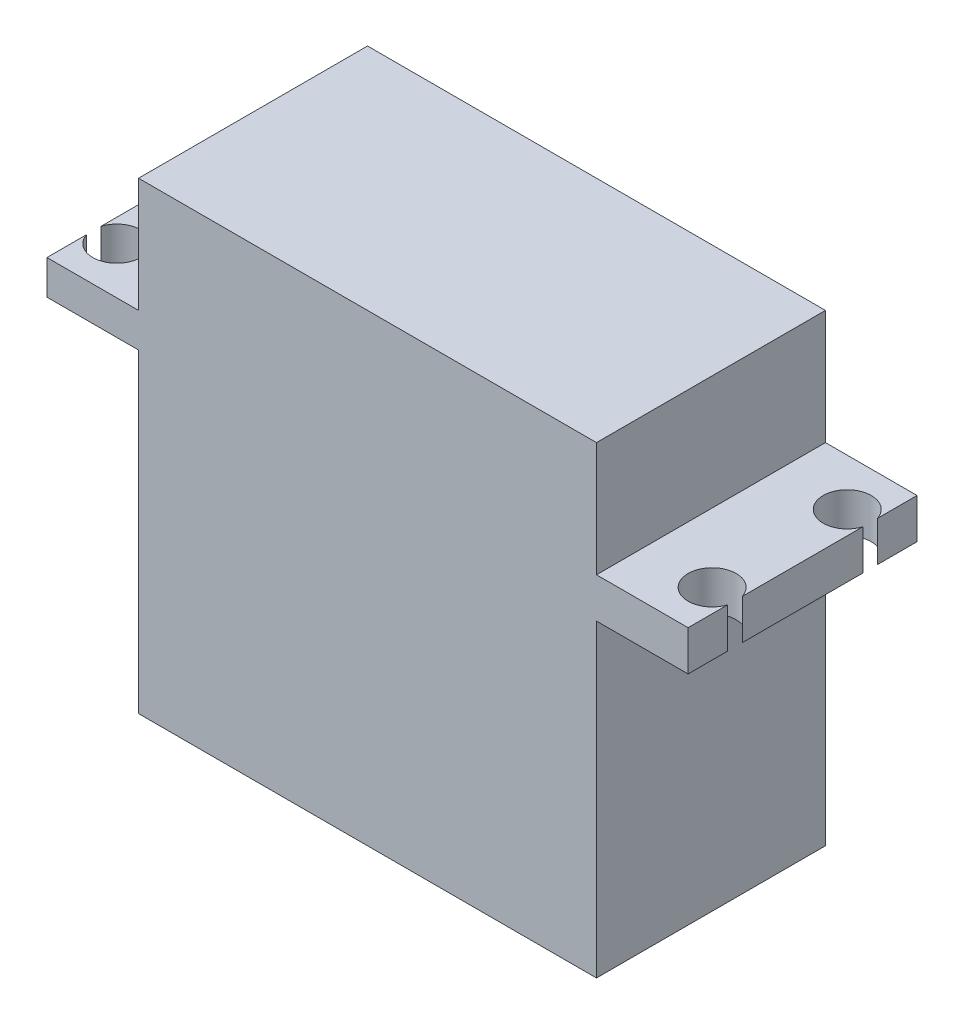
ISO-10303-21;
HEADER;
FILE_DESCRIPTION(('STEP AP214'),'2;1');
FILE_NAME('part.step','',(''),(''),'','','');
FILE_SCHEMA(('AUTOMOTIVE_DESIGN { 1 0 10303 214 1 1 1 1 }'));
ENDSEC;
DATA;
#1=APPLICATION_CONTEXT('core data for automotive mechanical design processes');
#2=APPLICATION_PROTOCOL_DEFINITION('international standard','automotive_design',2000,#1);
#3=PRODUCT_CONTEXT('',#1,'mechanical');
#4=PRODUCT('Part','Part','',(#3));
#5=PRODUCT_RELATED_PRODUCT_CATEGORY('part','',(#4));
#6=PRODUCT_DEFINITION_FORMATION('','',#4);
#7=PRODUCT_DEFINITION_CONTEXT('part definition',#1,'design');
#8=PRODUCT_DEFINITION('design','',#6,#7);
#9=PRODUCT_DEFINITION_SHAPE('','',#8);
#10=(LENGTH_UNIT() NAMED_UNIT(*) SI_UNIT(.MILLI.,.METRE.));
#11=(NAMED_UNIT(*) PLANE_ANGLE_UNIT() SI_UNIT($,.RADIAN.));
#12=(NAMED_UNIT(*) SI_UNIT($,.STERADIAN.) SOLID_ANGLE_UNIT());
#13=UNCERTAINTY_MEASURE_WITH_UNIT(LENGTH_MEASURE(1.E-05),#10,'distance_accuracy_value','');
#14=(GEOMETRIC_REPRESENTATION_CONTEXT(3) GLOBAL_UNCERTAINTY_ASSIGNED_CONTEXT((#13)) GLOBAL_UNIT_ASSIGNED_CONTEXT((#10,
#11,#12)) REPRESENTATION_CONTEXT('',''));
#15=CARTESIAN_POINT('',(0.,0.,0.));
#16=DIRECTION('',(0.,0.,1.));
#17=DIRECTION('',(1.,0.,0.));
#18=AXIS2_PLACEMENT_3D('',#15,#16,#17);
#19=CARTESIAN_POINT('',(-8.,0.,0.));
#20=DIRECTION('',(1.,0.,0.));
#21=DIRECTION('',(0.,0.,-1.));
#22=AXIS2_PLACEMENT_3D('',#19,#20,#21);
#23=PLANE('',#22);
#24=DIRECTION('',(0.,0.,1.));
#25=VECTOR('',#24,1.);
#26=CARTESIAN_POINT('',(-8.,27.5,0.));
#27=LINE('',#26,#25);
#28=CARTESIAN_POINT('',(-8.,27.5,-15.2596875762567));
#29=VERTEX_POINT('',#28);
#30=CARTESIAN_POINT('',(-8.,27.5,-4.74031242374329));
#31=VERTEX_POINT('',#30);
#32=EDGE_CURVE('E180',#29,#31,#27,.T.);
#33=ORIENTED_EDGE('',*,*,#32,.T.);
#34=DIRECTION('',(0.,1.,0.));
#35=VECTOR('',#34,1.);
#36=CARTESIAN_POINT('',(-8.,22.5,-4.74031242374329));
#37=LINE('',#36,#35);
#38=CARTESIAN_POINT('',(-8.,30.5,-4.74031242374329));
#39=VERTEX_POINT('',#38);
#40=EDGE_CURVE('E11',#31,#39,#37,.T.);
#41=ORIENTED_EDGE('',*,*,#40,.T.);
#42=DIRECTION('',(0.,0.,-1.));
#43=VECTOR('',#42,1.);
#44=CARTESIAN_POINT('',(-8.,30.5,-20.));
#45=LINE('',#44,#43);
#46=CARTESIAN_POINT('',(-8.,30.5,-15.2596875762567));
#47=VERTEX_POINT('',#46);
#48=EDGE_CURVE('E178',#39,#47,#45,.T.);
#49=ORIENTED_EDGE('',*,*,#48,.T.);
#50=DIRECTION('',(0.,1.,0.));
#51=VECTOR('',#50,1.);
#52=CARTESIAN_POINT('',(-8.,22.5,-15.2596875762567));
#53=LINE('',#52,#51);
#54=EDGE_CURVE('E304',#47,#29,#53,.F.);
#55=ORIENTED_EDGE('',*,*,#54,.T.);
#56=EDGE_LOOP('',(#33,#41,#49,#55));
#57=FACE_BOUND('',#56,.T.);
#58=ADVANCED_FACE('F33',(#57),#23,.F.);
#59=CARTESIAN_POINT('',(-8.,27.5,-20.));
#60=VERTEX_POINT('',#59);
#61=CARTESIAN_POINT('',(-8.,27.5,-16.5403124237433));
#62=VERTEX_POINT('',#61);
#63=EDGE_CURVE('E315',#60,#62,#27,.T.);
#64=ORIENTED_EDGE('',*,*,#63,.T.);
#65=DIRECTION('',(0.,1.,0.));
#66=VECTOR('',#65,1.);
#67=CARTESIAN_POINT('',(-8.,22.5,-16.5403124237433));
#68=LINE('',#67,#66);
#69=CARTESIAN_POINT('',(-8.,30.5,-16.5403124237433));
#70=VERTEX_POINT('',#69);
#71=EDGE_CURVE('E306',#62,#70,#68,.T.);
#72=ORIENTED_EDGE('',*,*,#71,.T.);
#73=CARTESIAN_POINT('',(-8.,30.5,-20.));
#74=VERTEX_POINT('',#73);
#75=EDGE_CURVE('E186',#70,#74,#45,.T.);
#76=ORIENTED_EDGE('',*,*,#75,.T.);
#77=DIRECTION('',(0.,-1.,0.));
#78=VECTOR('',#77,1.);
#79=CARTESIAN_POINT('',(-8.,27.5,-20.));
#80=LINE('',#79,#78);
#81=EDGE_CURVE('E188',#74,#60,#80,.T.);
#82=ORIENTED_EDGE('',*,*,#81,.T.);
#83=EDGE_LOOP('',(#64,#72,#76,#82));
#84=FACE_BOUND('',#83,.T.);
#85=ADVANCED_FACE('F334',(#84),#23,.F.);
#86=CARTESIAN_POINT('',(0.,0.,-20.));
#87=DIRECTION('',(-1.,0.,0.));
#88=DIRECTION('',(0.,0.,1.));
#89=AXIS2_PLACEMENT_3D('',#86,#87,#88);
#90=PLANE('',#89);
#91=DIRECTION('',(0.,0.,1.));
#92=VECTOR('',#91,1.);
#93=CARTESIAN_POINT('',(0.,27.5,0.));
#94=LINE('',#93,#92);
#95=CARTESIAN_POINT('',(0.,27.5,-20.));
#96=VERTEX_POINT('',#95);
#97=CARTESIAN_POINT('',(0.,27.5,0.));
#98=VERTEX_POINT('',#97);
#99=EDGE_CURVE('E195',#96,#98,#94,.T.);
#100=ORIENTED_EDGE('',*,*,#99,.F.);
#101=DIRECTION('',(0.,-1.,0.));
#102=VECTOR('',#101,1.);
#103=CARTESIAN_POINT('',(0.,0.,-20.));
#104=LINE('',#103,#102);
#105=CARTESIAN_POINT('',(0.,0.,-20.));
#106=VERTEX_POINT('',#105);
#107=EDGE_CURVE('E273',#96,#106,#104,.T.);
#108=ORIENTED_EDGE('',*,*,#107,.T.);
#109=DIRECTION('',(0.,0.,1.));
#110=VECTOR('',#109,1.);
#111=CARTESIAN_POINT('',(0.,0.,-20.));
#112=LINE('',#111,#110);
#113=CARTESIAN_POINT('',(0.,0.,0.));
#114=VERTEX_POINT('',#113);
#115=EDGE_CURVE('E289',#106,#114,#112,.T.);
#116=ORIENTED_EDGE('',*,*,#115,.T.);
#117=DIRECTION('',(0.,-1.,0.));
#118=VECTOR('',#117,1.);
#119=CARTESIAN_POINT('',(0.,0.,0.));
#120=LINE('',#119,#118);
#121=EDGE_CURVE('E286',#98,#114,#120,.T.);
#122=ORIENTED_EDGE('',*,*,#121,.F.);
#123=EDGE_LOOP('',(#100,#108,#116,#122));
#124=FACE_BOUND('',#123,.T.);
#125=ADVANCED_FACE('F339',(#124),#90,.T.);
#126=CARTESIAN_POINT('',(48.,0.,0.));
#127=DIRECTION('',(-1.,0.,0.));
#128=DIRECTION('',(0.,0.,1.));
#129=AXIS2_PLACEMENT_3D('',#126,#127,#128);
#130=PLANE('',#129);
#131=DIRECTION('',(0.,0.,-1.));
#132=VECTOR('',#131,1.);
#133=CARTESIAN_POINT('',(48.,27.,0.));
#134=LINE('',#133,#132);
#135=CARTESIAN_POINT('',(48.,27.,0.));
#136=VERTEX_POINT('',#135);
#137=CARTESIAN_POINT('',(48.,27.,-3.45968757625673));
#138=VERTEX_POINT('',#137);
#139=EDGE_CURVE('E235',#136,#138,#134,.T.);
#140=ORIENTED_EDGE('',*,*,#139,.T.);
#141=DIRECTION('',(0.,1.,0.));
#142=VECTOR('',#141,1.);
#143=CARTESIAN_POINT('',(48.,22.5000000000004,-3.45968757625673));
#144=LINE('',#143,#142);
#145=CARTESIAN_POINT('',(48.,30.5000000000004,-3.45968757625673));
#146=VERTEX_POINT('',#145);
#147=EDGE_CURVE('E221',#138,#146,#144,.T.);
#148=ORIENTED_EDGE('',*,*,#147,.T.);
#149=DIRECTION('',(0.,0.,1.));
#150=VECTOR('',#149,1.);
#151=CARTESIAN_POINT('',(48.,30.5000000000004,0.));
#152=LINE('',#151,#150);
#153=CARTESIAN_POINT('',(48.,30.5000000000004,0.));
#154=VERTEX_POINT('',#153);
#155=EDGE_CURVE('E241',#146,#154,#152,.T.);
#156=ORIENTED_EDGE('',*,*,#155,.T.);
#157=DIRECTION('',(0.,-1.,0.));
#158=VECTOR('',#157,1.);
#159=CARTESIAN_POINT('',(48.,27.,0.));
#160=LINE('',#159,#158);
#161=EDGE_CURVE('E230',#154,#136,#160,.T.);
#162=ORIENTED_EDGE('',*,*,#161,.T.);
#163=EDGE_LOOP('',(#140,#148,#156,#162));
#164=FACE_BOUND('',#163,.T.);
#165=ADVANCED_FACE('F353',(#164),#130,.F.);
#166=CARTESIAN_POINT('',(48.,30.5000000000004,-15.2596875762567));
#167=VERTEX_POINT('',#166);
#168=CARTESIAN_POINT('',(48.,30.5000000000004,-4.74031242374327));
#169=VERTEX_POINT('',#168);
#170=EDGE_CURVE('E246',#167,#169,#152,.T.);
#171=ORIENTED_EDGE('',*,*,#170,.T.);
#172=DIRECTION('',(0.,1.,0.));
#173=VECTOR('',#172,1.);
#174=CARTESIAN_POINT('',(48.,22.5000000000004,-4.74031242374327));
#175=LINE('',#174,#173);
#176=CARTESIAN_POINT('',(48.,27.,-4.74031242374327));
#177=VERTEX_POINT('',#176);
#178=EDGE_CURVE('E218',#169,#177,#175,.F.);
#179=ORIENTED_EDGE('',*,*,#178,.T.);
#180=CARTESIAN_POINT('',(48.,27.,-15.2596875762567));
#181=VERTEX_POINT('',#180);
#182=EDGE_CURVE('E239',#177,#181,#134,.T.);
#183=ORIENTED_EDGE('',*,*,#182,.T.);
#184=DIRECTION('',(0.,1.,0.));
#185=VECTOR('',#184,1.);
#186=CARTESIAN_POINT('',(48.,22.5000000000004,-15.2596875762567));
#187=LINE('',#186,#185);
#188=EDGE_CURVE('E301',#181,#167,#187,.T.);
#189=ORIENTED_EDGE('',*,*,#188,.T.);
#190=EDGE_LOOP('',(#171,#179,#183,#189));
#191=FACE_BOUND('',#190,.T.);
#192=ADVANCED_FACE('F409',(#191),#130,.F.);
#193=CARTESIAN_POINT('',(40.,40.5000000000004,-20.));
#194=DIRECTION('',(1.,0.,0.));
#195=DIRECTION('',(0.,1.,0.));
#196=AXIS2_PLACEMENT_3D('',#193,#194,#195);
#197=PLANE('',#196);
#198=DIRECTION('',(0.,0.,1.));
#199=VECTOR('',#198,1.);
#200=CARTESIAN_POINT('',(40.,30.5000000000004,0.));
#201=LINE('',#200,#199);
#202=CARTESIAN_POINT('',(40.,30.5000000000004,-20.));
#203=VERTEX_POINT('',#202);
#204=CARTESIAN_POINT('',(40.,30.5000000000004,0.));
#205=VERTEX_POINT('',#204);
#206=EDGE_CURVE('E234',#203,#205,#201,.T.);
#207=ORIENTED_EDGE('',*,*,#206,.F.);
#208=DIRECTION('',(0.,1.,0.));
#209=VECTOR('',#208,1.);
#210=CARTESIAN_POINT('',(40.,40.5000000000004,-20.));
#211=LINE('',#210,#209);
#212=CARTESIAN_POINT('',(40.,40.5000000000004,-20.));
#213=VERTEX_POINT('',#212);
#214=EDGE_CURVE('E266',#203,#213,#211,.T.);
#215=ORIENTED_EDGE('',*,*,#214,.T.);
#216=DIRECTION('',(0.,0.,1.));
#217=VECTOR('',#216,1.);
#218=CARTESIAN_POINT('',(40.,40.5000000000004,-20.));
#219=LINE('',#218,#217);
#220=CARTESIAN_POINT('',(40.,40.5000000000004,0.));
#221=VERTEX_POINT('',#220);
#222=EDGE_CURVE('E295',#213,#221,#219,.T.);
#223=ORIENTED_EDGE('',*,*,#222,.T.);
#224=DIRECTION('',(0.,1.,0.));
#225=VECTOR('',#224,1.);
#226=CARTESIAN_POINT('',(40.,40.5000000000004,0.));
#227=LINE('',#226,#225);
#228=EDGE_CURVE('E279',#205,#221,#227,.T.);
#229=ORIENTED_EDGE('',*,*,#228,.F.);
#230=EDGE_LOOP('',(#207,#215,#223,#229));
#231=FACE_BOUND('',#230,.T.);
#232=ADVANCED_FACE('F363',(#231),#197,.T.);
#233=CARTESIAN_POINT('',(40.,0.,-20.));
#234=DIRECTION('',(0.,-1.,0.));
#235=DIRECTION('',(1.,0.,0.));
#236=AXIS2_PLACEMENT_3D('',#233,#234,#235);
#237=PLANE('',#236);
#238=DIRECTION('',(1.,0.,0.));
#239=VECTOR('',#238,1.);
#240=CARTESIAN_POINT('',(40.,0.,0.));
#241=LINE('',#240,#239);
#242=CARTESIAN_POINT('',(40.,0.,0.));
#243=VERTEX_POINT('',#242);
#244=EDGE_CURVE('E262',#114,#243,#241,.T.);
#245=ORIENTED_EDGE('',*,*,#244,.F.);
#246=ORIENTED_EDGE('',*,*,#115,.F.);
#247=DIRECTION('',(1.,0.,0.));
#248=VECTOR('',#247,1.);
#249=CARTESIAN_POINT('',(40.,0.,-20.));
#250=LINE('',#249,#248);
#251=CARTESIAN_POINT('',(40.,0.,-20.));
#252=VERTEX_POINT('',#251);
#253=EDGE_CURVE('E263',#106,#252,#250,.T.);
#254=ORIENTED_EDGE('',*,*,#253,.T.);
#255=DIRECTION('',(0.,0.,1.));
#256=VECTOR('',#255,1.);
#257=CARTESIAN_POINT('',(40.,0.,-20.));
#258=LINE('',#257,#256);
#259=EDGE_CURVE('E276',#252,#243,#258,.T.);
#260=ORIENTED_EDGE('',*,*,#259,.T.);
#261=EDGE_LOOP('',(#245,#246,#254,#260));
#262=FACE_BOUND('',#261,.T.);
#263=ADVANCED_FACE('F35',(#262),#237,.T.);
#264=DIRECTION('',(0.,0.,-1.));
#265=VECTOR('',#264,1.);
#266=CARTESIAN_POINT('',(0.,30.5,-20.));
#267=LINE('',#266,#265);
#268=CARTESIAN_POINT('',(0.,30.5,0.));
#269=VERTEX_POINT('',#268);
#270=CARTESIAN_POINT('',(0.,30.5,-20.));
#271=VERTEX_POINT('',#270);
#272=EDGE_CURVE('E198',#269,#271,#267,.T.);
#273=ORIENTED_EDGE('',*,*,#272,.F.);
#274=CARTESIAN_POINT('',(0.,40.5,0.));
#275=VERTEX_POINT('',#274);
#276=EDGE_CURVE('E267',#275,#269,#120,.T.);
#277=ORIENTED_EDGE('',*,*,#276,.F.);
#278=DIRECTION('',(0.,0.,1.));
#279=VECTOR('',#278,1.);
#280=CARTESIAN_POINT('',(0.,40.5,-20.));
#281=LINE('',#280,#279);
#282=CARTESIAN_POINT('',(0.,40.5,-20.));
#283=VERTEX_POINT('',#282);
#284=EDGE_CURVE('E293',#283,#275,#281,.T.);
#285=ORIENTED_EDGE('',*,*,#284,.F.);
#286=EDGE_CURVE('E274',#283,#271,#104,.T.);
#287=ORIENTED_EDGE('',*,*,#286,.T.);
#288=EDGE_LOOP('',(#273,#277,#285,#287));
#289=FACE_BOUND('',#288,.T.);
#290=ADVANCED_FACE('F369',(#289),#90,.T.);
#291=CARTESIAN_POINT('',(0.,40.5,-20.));
#292=DIRECTION('',(0.,1.,0.));
#293=DIRECTION('',(-1.,0.,0.));
#294=AXIS2_PLACEMENT_3D('',#291,#292,#293);
#295=PLANE('',#294);
#296=DIRECTION('',(-1.,0.,0.));
#297=VECTOR('',#296,1.);
#298=CARTESIAN_POINT('',(0.,40.5,0.));
#299=LINE('',#298,#297);
#300=EDGE_CURVE('E283',#221,#275,#299,.T.);
#301=ORIENTED_EDGE('',*,*,#300,.F.);
#302=ORIENTED_EDGE('',*,*,#222,.F.);
#303=DIRECTION('',(-1.,0.,0.));
#304=VECTOR('',#303,1.);
#305=CARTESIAN_POINT('',(0.,40.5,-20.));
#306=LINE('',#305,#304);
#307=EDGE_CURVE('E270',#213,#283,#306,.T.);
#308=ORIENTED_EDGE('',*,*,#307,.T.);
#309=ORIENTED_EDGE('',*,*,#284,.T.);
#310=EDGE_LOOP('',(#301,#302,#308,#309));
#311=FACE_BOUND('',#310,.T.);
#312=ADVANCED_FACE('F368',(#311),#295,.T.);
#313=DIRECTION('',(0.,0.,-1.));
#314=VECTOR('',#313,1.);
#315=CARTESIAN_POINT('',(40.,27.,0.));
#316=LINE('',#315,#314);
#317=CARTESIAN_POINT('',(40.,27.,0.));
#318=VERTEX_POINT('',#317);
#319=CARTESIAN_POINT('',(40.,27.,-20.));
#320=VERTEX_POINT('',#319);
#321=EDGE_CURVE('E229',#318,#320,#316,.T.);
#322=ORIENTED_EDGE('',*,*,#321,.F.);
#323=EDGE_CURVE('E280',#243,#318,#227,.T.);
#324=ORIENTED_EDGE('',*,*,#323,.F.);
#325=ORIENTED_EDGE('',*,*,#259,.F.);
#326=EDGE_CURVE('E268',#252,#320,#211,.T.);
#327=ORIENTED_EDGE('',*,*,#326,.T.);
#328=EDGE_LOOP('',(#322,#324,#325,#327));
#329=FACE_BOUND('',#328,.T.);
#330=ADVANCED_FACE('F376',(#329),#197,.T.);
#331=CARTESIAN_POINT('',(0.,0.,-20.));
#332=DIRECTION('',(0.,0.,-1.));
#333=DIRECTION('',(-1.,0.,0.));
#334=AXIS2_PLACEMENT_3D('',#331,#332,#333);
#335=PLANE('',#334);
#336=ORIENTED_EDGE('',*,*,#253,.F.);
#337=ORIENTED_EDGE('',*,*,#107,.F.);
#338=DIRECTION('',(1.,0.,0.));
#339=VECTOR('',#338,1.);
#340=CARTESIAN_POINT('',(-8.,27.5,-20.));
#341=LINE('',#340,#339);
#342=EDGE_CURVE('E194',#60,#96,#341,.T.);
#343=ORIENTED_EDGE('',*,*,#342,.F.);
#344=ORIENTED_EDGE('',*,*,#81,.F.);
#345=DIRECTION('',(1.,0.,0.));
#346=VECTOR('',#345,1.);
#347=CARTESIAN_POINT('',(-8.,30.5,-20.));
#348=LINE('',#347,#346);
#349=EDGE_CURVE('E204',#74,#271,#348,.T.);
#350=ORIENTED_EDGE('',*,*,#349,.T.);
#351=ORIENTED_EDGE('',*,*,#286,.F.);
#352=ORIENTED_EDGE('',*,*,#307,.F.);
#353=ORIENTED_EDGE('',*,*,#214,.F.);
#354=DIRECTION('',(-1.,0.,0.));
#355=VECTOR('',#354,1.);
#356=CARTESIAN_POINT('',(48.,30.5000000000004,-20.));
#357=LINE('',#356,#355);
#358=CARTESIAN_POINT('',(48.,30.5000000000004,-20.));
#359=VERTEX_POINT('',#358);
#360=EDGE_CURVE('E253',#359,#203,#357,.T.);
#361=ORIENTED_EDGE('',*,*,#360,.F.);
#362=DIRECTION('',(0.,1.,0.));
#363=VECTOR('',#362,1.);
#364=CARTESIAN_POINT('',(48.,30.5000000000004,-20.));
#365=LINE('',#364,#363);
#366=CARTESIAN_POINT('',(48.,27.,-20.));
#367=VERTEX_POINT('',#366);
#368=EDGE_CURVE('E238',#367,#359,#365,.T.);
#369=ORIENTED_EDGE('',*,*,#368,.F.);
#370=DIRECTION('',(-1.,0.,0.));
#371=VECTOR('',#370,1.);
#372=CARTESIAN_POINT('',(48.,27.,-20.));
#373=LINE('',#372,#371);
#374=EDGE_CURVE('E256',#367,#320,#373,.T.);
#375=ORIENTED_EDGE('',*,*,#374,.T.);
#376=ORIENTED_EDGE('',*,*,#326,.F.);
#377=EDGE_LOOP('',(#336,#337,#343,#344,#350,#351,#352,#353,#361,#369,#375,#376));
#378=FACE_BOUND('',#377,.T.);
#379=ADVANCED_FACE('F330',(#378),#335,.T.);
#380=CARTESIAN_POINT('',(0.,0.,0.));
#381=DIRECTION('',(0.,0.,-1.));
#382=DIRECTION('',(-1.,0.,0.));
#383=AXIS2_PLACEMENT_3D('',#380,#381,#382);
#384=PLANE('',#383);
#385=ORIENTED_EDGE('',*,*,#244,.T.);
#386=ORIENTED_EDGE('',*,*,#323,.T.);
#387=DIRECTION('',(-1.,0.,0.));
#388=VECTOR('',#387,1.);
#389=CARTESIAN_POINT('',(48.,27.,0.));
#390=LINE('',#389,#388);
#391=EDGE_CURVE('E259',#136,#318,#390,.T.);
#392=ORIENTED_EDGE('',*,*,#391,.F.);
#393=ORIENTED_EDGE('',*,*,#161,.F.);
#394=DIRECTION('',(-1.,0.,0.));
#395=VECTOR('',#394,1.);
#396=CARTESIAN_POINT('',(48.,30.5000000000004,0.));
#397=LINE('',#396,#395);
#398=EDGE_CURVE('E245',#154,#205,#397,.T.);
#399=ORIENTED_EDGE('',*,*,#398,.T.);
#400=ORIENTED_EDGE('',*,*,#228,.T.);
#401=ORIENTED_EDGE('',*,*,#300,.T.);
#402=ORIENTED_EDGE('',*,*,#276,.T.);
#403=DIRECTION('',(1.,0.,0.));
#404=VECTOR('',#403,1.);
#405=CARTESIAN_POINT('',(-8.,30.5,0.));
#406=LINE('',#405,#404);
#407=CARTESIAN_POINT('',(-8.,30.5,0.));
#408=VERTEX_POINT('',#407);
#409=EDGE_CURVE('E207',#408,#269,#406,.T.);
#410=ORIENTED_EDGE('',*,*,#409,.F.);
#411=DIRECTION('',(0.,1.,0.));
#412=VECTOR('',#411,1.);
#413=CARTESIAN_POINT('',(-8.,30.5,0.));
#414=LINE('',#413,#412);
#415=CARTESIAN_POINT('',(-8.,27.5,0.));
#416=VERTEX_POINT('',#415);
#417=EDGE_CURVE('E189',#416,#408,#414,.T.);
#418=ORIENTED_EDGE('',*,*,#417,.F.);
#419=DIRECTION('',(1.,0.,0.));
#420=VECTOR('',#419,1.);
#421=CARTESIAN_POINT('',(-8.,27.5,0.));
#422=LINE('',#421,#420);
#423=EDGE_CURVE('E210',#416,#98,#422,.T.);
#424=ORIENTED_EDGE('',*,*,#423,.T.);
#425=ORIENTED_EDGE('',*,*,#121,.T.);
#426=EDGE_LOOP('',(#385,#386,#392,#393,#399,#400,#401,#402,#410,#418,#424,#425));
#427=FACE_BOUND('',#426,.T.);
#428=ADVANCED_FACE('F322',(#427),#384,.F.);
#429=CARTESIAN_POINT('',(48.,27.,0.));
#430=DIRECTION('',(0.,1.,0.));
#431=DIRECTION('',(-1.,0.,0.));
#432=AXIS2_PLACEMENT_3D('',#429,#430,#431);
#433=PLANE('',#432);
#434=ORIENTED_EDGE('',*,*,#182,.F.);
#435=CARTESIAN_POINT('',(46.,27.,-4.1));
#436=DIRECTION('',(0.,1.,0.));
#437=DIRECTION('',(-1.,0.,0.));
#438=AXIS2_PLACEMENT_3D('',#435,#436,#437);
#439=CIRCLE('',#438,2.1);
#440=EDGE_CURVE('E215',#177,#138,#439,.T.);
#441=ORIENTED_EDGE('',*,*,#440,.T.);
#442=ORIENTED_EDGE('',*,*,#139,.F.);
#443=ORIENTED_EDGE('',*,*,#391,.T.);
#444=ORIENTED_EDGE('',*,*,#321,.T.);
#445=ORIENTED_EDGE('',*,*,#374,.F.);
#446=CARTESIAN_POINT('',(48.,27.,-16.5403124237433));
#447=VERTEX_POINT('',#446);
#448=EDGE_CURVE('E233',#447,#367,#134,.T.);
#449=ORIENTED_EDGE('',*,*,#448,.F.);
#450=CARTESIAN_POINT('',(46.,27.,-15.9));
#451=DIRECTION('',(0.,1.,0.));
#452=DIRECTION('',(-1.,0.,0.));
#453=AXIS2_PLACEMENT_3D('',#450,#451,#452);
#454=CIRCLE('',#453,2.1);
#455=EDGE_CURVE('E226',#447,#181,#454,.T.);
#456=ORIENTED_EDGE('',*,*,#455,.T.);
#457=EDGE_LOOP('',(#434,#441,#442,#443,#444,#445,#449,#456));
#458=FACE_BOUND('',#457,.T.);
#459=ADVANCED_FACE('F350',(#458),#433,.F.);
#460=CARTESIAN_POINT('',(48.,30.5000000000004,0.));
#461=DIRECTION('',(0.,-1.,0.));
#462=DIRECTION('',(1.,0.,0.));
#463=AXIS2_PLACEMENT_3D('',#460,#461,#462);
#464=PLANE('',#463);
#465=ORIENTED_EDGE('',*,*,#155,.F.);
#466=CARTESIAN_POINT('',(46.,30.5000000000004,-4.1));
#467=DIRECTION('',(0.,1.,0.));
#468=DIRECTION('',(1.,0.,0.));
#469=AXIS2_PLACEMENT_3D('',#466,#467,#468);
#470=CIRCLE('',#469,2.1);
#471=EDGE_CURVE('E213',#169,#146,#470,.T.);
#472=ORIENTED_EDGE('',*,*,#471,.F.);
#473=ORIENTED_EDGE('',*,*,#170,.F.);
#474=CARTESIAN_POINT('',(46.,30.5000000000004,-15.9));
#475=DIRECTION('',(0.,1.,0.));
#476=DIRECTION('',(-1.,0.,0.));
#477=AXIS2_PLACEMENT_3D('',#474,#475,#476);
#478=CIRCLE('',#477,2.1);
#479=CARTESIAN_POINT('',(48.,30.5000000000004,-16.5403124237433));
#480=VERTEX_POINT('',#479);
#481=EDGE_CURVE('E224',#480,#167,#478,.T.);
#482=ORIENTED_EDGE('',*,*,#481,.F.);
#483=EDGE_CURVE('E242',#359,#480,#152,.T.);
#484=ORIENTED_EDGE('',*,*,#483,.F.);
#485=ORIENTED_EDGE('',*,*,#360,.T.);
#486=ORIENTED_EDGE('',*,*,#206,.T.);
#487=ORIENTED_EDGE('',*,*,#398,.F.);
#488=EDGE_LOOP('',(#465,#472,#473,#482,#484,#485,#486,#487));
#489=FACE_BOUND('',#488,.T.);
#490=ADVANCED_FACE('F357',(#489),#464,.F.);
#491=ORIENTED_EDGE('',*,*,#483,.T.);
#492=DIRECTION('',(0.,1.,0.));
#493=VECTOR('',#492,1.);
#494=CARTESIAN_POINT('',(48.,22.5000000000004,-16.5403124237433));
#495=LINE('',#494,#493);
#496=EDGE_CURVE('E292',#480,#447,#495,.F.);
#497=ORIENTED_EDGE('',*,*,#496,.T.);
#498=ORIENTED_EDGE('',*,*,#448,.T.);
#499=ORIENTED_EDGE('',*,*,#368,.T.);
#500=EDGE_LOOP('',(#491,#497,#498,#499));
#501=FACE_BOUND('',#500,.T.);
#502=ADVANCED_FACE('F404',(#501),#130,.F.);
#503=CARTESIAN_POINT('',(46.,22.5000000000004,-15.9));
#504=DIRECTION('',(0.,1.,0.));
#505=DIRECTION('',(-1.,0.,0.));
#506=AXIS2_PLACEMENT_3D('',#503,#504,#505);
#507=CYLINDRICAL_SURFACE('',#506,2.1);
#508=ORIENTED_EDGE('',*,*,#455,.F.);
#509=ORIENTED_EDGE('',*,*,#496,.F.);
#510=ORIENTED_EDGE('',*,*,#481,.T.);
#511=ORIENTED_EDGE('',*,*,#188,.F.);
#512=EDGE_LOOP('',(#508,#509,#510,#511));
#513=FACE_BOUND('',#512,.T.);
#514=ADVANCED_FACE('F400',(#513),#507,.F.);
#515=CARTESIAN_POINT('',(46.,22.5000000000004,-4.1));
#516=DIRECTION('',(0.,1.,0.));
#517=DIRECTION('',(-1.,0.,0.));
#518=AXIS2_PLACEMENT_3D('',#515,#516,#517);
#519=CYLINDRICAL_SURFACE('',#518,2.1);
#520=ORIENTED_EDGE('',*,*,#440,.F.);
#521=ORIENTED_EDGE('',*,*,#178,.F.);
#522=ORIENTED_EDGE('',*,*,#471,.T.);
#523=ORIENTED_EDGE('',*,*,#147,.F.);
#524=EDGE_LOOP('',(#520,#521,#522,#523));
#525=FACE_BOUND('',#524,.T.);
#526=ADVANCED_FACE('F395',(#525),#519,.F.);
#527=CARTESIAN_POINT('',(-8.,27.5,0.));
#528=DIRECTION('',(0.,1.,0.));
#529=DIRECTION('',(0.,0.,1.));
#530=AXIS2_PLACEMENT_3D('',#527,#528,#529);
#531=PLANE('',#530);
#532=CARTESIAN_POINT('',(-8.,27.5,-3.45968757625671));
#533=VERTEX_POINT('',#532);
#534=EDGE_CURVE('E201',#533,#416,#27,.T.);
#535=ORIENTED_EDGE('',*,*,#534,.F.);
#536=CARTESIAN_POINT('',(-6.,27.5,-4.1));
#537=DIRECTION('',(0.,1.,0.));
#538=DIRECTION('',(0.,0.,1.));
#539=AXIS2_PLACEMENT_3D('',#536,#537,#538);
#540=CIRCLE('',#539,2.1);
#541=EDGE_CURVE('E48',#533,#31,#540,.T.);
#542=ORIENTED_EDGE('',*,*,#541,.T.);
#543=ORIENTED_EDGE('',*,*,#32,.F.);
#544=CARTESIAN_POINT('',(-6.,27.5,-15.9));
#545=DIRECTION('',(0.,1.,0.));
#546=DIRECTION('',(0.,0.,1.));
#547=AXIS2_PLACEMENT_3D('',#544,#545,#546);
#548=CIRCLE('',#547,2.1);
#549=EDGE_CURVE('E56',#29,#62,#548,.T.);
#550=ORIENTED_EDGE('',*,*,#549,.T.);
#551=ORIENTED_EDGE('',*,*,#63,.F.);
#552=ORIENTED_EDGE('',*,*,#342,.T.);
#553=ORIENTED_EDGE('',*,*,#99,.T.);
#554=ORIENTED_EDGE('',*,*,#423,.F.);
#555=EDGE_LOOP('',(#535,#542,#543,#550,#551,#552,#553,#554));
#556=FACE_BOUND('',#555,.T.);
#557=ADVANCED_FACE('F314',(#556),#531,.F.);
#558=CARTESIAN_POINT('',(-8.,30.5,-20.));
#559=DIRECTION('',(0.,-1.,0.));
#560=DIRECTION('',(0.,0.,-1.));
#561=AXIS2_PLACEMENT_3D('',#558,#559,#560);
#562=PLANE('',#561);
#563=ORIENTED_EDGE('',*,*,#48,.F.);
#564=CARTESIAN_POINT('',(-6.,30.5,-4.1));
#565=DIRECTION('',(0.,1.,0.));
#566=DIRECTION('',(0.,0.,-1.));
#567=AXIS2_PLACEMENT_3D('',#564,#565,#566);
#568=CIRCLE('',#567,2.1);
#569=CARTESIAN_POINT('',(-8.,30.5,-3.45968757625671));
#570=VERTEX_POINT('',#569);
#571=EDGE_CURVE('E169',#570,#39,#568,.T.);
#572=ORIENTED_EDGE('',*,*,#571,.F.);
#573=EDGE_CURVE('E185',#408,#570,#45,.T.);
#574=ORIENTED_EDGE('',*,*,#573,.F.);
#575=ORIENTED_EDGE('',*,*,#409,.T.);
#576=ORIENTED_EDGE('',*,*,#272,.T.);
#577=ORIENTED_EDGE('',*,*,#349,.F.);
#578=ORIENTED_EDGE('',*,*,#75,.F.);
#579=CARTESIAN_POINT('',(-6.,30.5,-15.9));
#580=DIRECTION('',(0.,1.,0.));
#581=DIRECTION('',(0.,0.,1.));
#582=AXIS2_PLACEMENT_3D('',#579,#580,#581);
#583=CIRCLE('',#582,2.1);
#584=EDGE_CURVE('E184',#47,#70,#583,.T.);
#585=ORIENTED_EDGE('',*,*,#584,.F.);
#586=EDGE_LOOP('',(#563,#572,#574,#575,#576,#577,#578,#585));
#587=FACE_BOUND('',#586,.T.);
#588=ADVANCED_FACE('F182',(#587),#562,.F.);
#589=ORIENTED_EDGE('',*,*,#573,.T.);
#590=DIRECTION('',(0.,1.,0.));
#591=VECTOR('',#590,1.);
#592=CARTESIAN_POINT('',(-8.,22.5,-3.45968757625671));
#593=LINE('',#592,#591);
#594=EDGE_CURVE('E41',#570,#533,#593,.F.);
#595=ORIENTED_EDGE('',*,*,#594,.T.);
#596=ORIENTED_EDGE('',*,*,#534,.T.);
#597=ORIENTED_EDGE('',*,*,#417,.T.);
#598=EDGE_LOOP('',(#589,#595,#596,#597));
#599=FACE_BOUND('',#598,.T.);
#600=ADVANCED_FACE('F310',(#599),#23,.F.);
#601=CARTESIAN_POINT('',(-6.,22.5,-15.9));
#602=DIRECTION('',(0.,1.,0.));
#603=DIRECTION('',(0.,0.,1.));
#604=AXIS2_PLACEMENT_3D('',#601,#602,#603);
#605=CYLINDRICAL_SURFACE('',#604,2.1);
#606=ORIENTED_EDGE('',*,*,#549,.F.);
#607=ORIENTED_EDGE('',*,*,#54,.F.);
#608=ORIENTED_EDGE('',*,*,#584,.T.);
#609=ORIENTED_EDGE('',*,*,#71,.F.);
#610=EDGE_LOOP('',(#606,#607,#608,#609));
#611=FACE_BOUND('',#610,.T.);
#612=ADVANCED_FACE('F335',(#611),#605,.F.);
#613=CARTESIAN_POINT('',(-6.,22.5,-4.1));
#614=DIRECTION('',(0.,1.,0.));
#615=DIRECTION('',(0.,0.,1.));
#616=AXIS2_PLACEMENT_3D('',#613,#614,#615);
#617=CYLINDRICAL_SURFACE('',#616,2.1);
#618=ORIENTED_EDGE('',*,*,#541,.F.);
#619=ORIENTED_EDGE('',*,*,#594,.F.);
#620=ORIENTED_EDGE('',*,*,#571,.T.);
#621=ORIENTED_EDGE('',*,*,#40,.F.);
#622=EDGE_LOOP('',(#618,#619,#620,#621));
#623=FACE_BOUND('',#622,.T.);
#624=ADVANCED_FACE('F170',(#623),#617,.F.);
#625=CLOSED_SHELL('',(#58,#85,#125,#165,#192,#232,#263,#290,#312,#330,#379,#428,#459,#490,#502,
#514,#526,#557,#588,#600,#612,#624));
#626=MANIFOLD_SOLID_BREP('B2',#625);
#627=ADVANCED_BREP_SHAPE_REPRESENTATION('',(#18,#626),#14);
#628=SHAPE_DEFINITION_REPRESENTATION(#9,#627);
ENDSEC;
END-ISO-10303-21;
